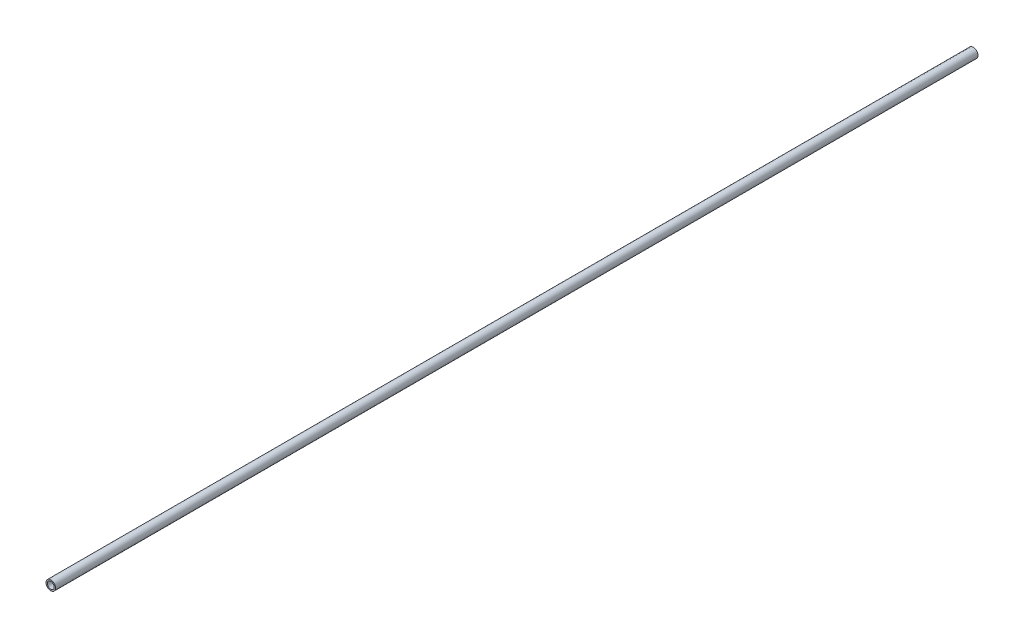
ISO-10303-21;
HEADER;
FILE_DESCRIPTION(('STEP AP214'),'2;1');
FILE_NAME('part.step','',(''),(''),'','','');
FILE_SCHEMA(('AUTOMOTIVE_DESIGN { 1 0 10303 214 1 1 1 1 }'));
ENDSEC;
DATA;
#1=APPLICATION_CONTEXT('core data for automotive mechanical design processes');
#2=APPLICATION_PROTOCOL_DEFINITION('international standard','automotive_design',2000,#1);
#3=PRODUCT_CONTEXT('',#1,'mechanical');
#4=PRODUCT('Part','Part','',(#3));
#5=PRODUCT_RELATED_PRODUCT_CATEGORY('part','',(#4));
#6=PRODUCT_DEFINITION_FORMATION('','',#4);
#7=PRODUCT_DEFINITION_CONTEXT('part definition',#1,'design');
#8=PRODUCT_DEFINITION('design','',#6,#7);
#9=PRODUCT_DEFINITION_SHAPE('','',#8);
#10=(LENGTH_UNIT() NAMED_UNIT(*) SI_UNIT(.MILLI.,.METRE.));
#11=(NAMED_UNIT(*) PLANE_ANGLE_UNIT() SI_UNIT($,.RADIAN.));
#12=(NAMED_UNIT(*) SI_UNIT($,.STERADIAN.) SOLID_ANGLE_UNIT());
#13=UNCERTAINTY_MEASURE_WITH_UNIT(LENGTH_MEASURE(1.E-05),#10,'distance_accuracy_value','');
#14=(GEOMETRIC_REPRESENTATION_CONTEXT(3) GLOBAL_UNCERTAINTY_ASSIGNED_CONTEXT((#13)) GLOBAL_UNIT_ASSIGNED_CONTEXT((#10,
#11,#12)) REPRESENTATION_CONTEXT('',''));
#15=CARTESIAN_POINT('',(0.,0.,0.));
#16=DIRECTION('',(0.,0.,1.));
#17=DIRECTION('',(1.,0.,0.));
#18=AXIS2_PLACEMENT_3D('',#15,#16,#17);
#19=CARTESIAN_POINT('',(0.,0.,-340.));
#20=DIRECTION('',(0.,0.,1.));
#21=DIRECTION('',(1.,0.,0.));
#22=AXIS2_PLACEMENT_3D('',#19,#20,#21);
#23=CYLINDRICAL_SURFACE('',#22,1.75);
#24=CARTESIAN_POINT('',(0.,0.,-340.));
#25=DIRECTION('',(0.,0.,1.));
#26=DIRECTION('',(1.,0.,0.));
#27=AXIS2_PLACEMENT_3D('',#24,#25,#26);
#28=CIRCLE('',#27,1.75);
#29=CARTESIAN_POINT('',(1.75,0.,-340.));
#30=VERTEX_POINT('',#29);
#31=EDGE_CURVE('E10',#30,#30,#28,.T.);
#32=ORIENTED_EDGE('',*,*,#31,.T.);
#33=EDGE_LOOP('',(#32));
#34=FACE_BOUND('',#33,.T.);
#35=CARTESIAN_POINT('',(0.,0.,0.));
#36=DIRECTION('',(0.,0.,1.));
#37=DIRECTION('',(1.,0.,0.));
#38=AXIS2_PLACEMENT_3D('',#35,#36,#37);
#39=CIRCLE('',#38,1.75);
#40=CARTESIAN_POINT('',(1.75,0.,0.));
#41=VERTEX_POINT('',#40);
#42=EDGE_CURVE('E42',#41,#41,#39,.T.);
#43=ORIENTED_EDGE('',*,*,#42,.F.);
#44=EDGE_LOOP('',(#43));
#45=FACE_BOUND('',#44,.T.);
#46=ADVANCED_FACE('F39',(#34,#45),#23,.T.);
#47=CARTESIAN_POINT('',(0.,0.,-340.));
#48=DIRECTION('',(0.,0.,1.));
#49=DIRECTION('',(1.,0.,0.));
#50=AXIS2_PLACEMENT_3D('',#47,#48,#49);
#51=PLANE('',#50);
#52=CARTESIAN_POINT('',(0.,0.,-340.));
#53=DIRECTION('',(0.,0.,1.));
#54=DIRECTION('',(1.,0.,0.));
#55=AXIS2_PLACEMENT_3D('',#52,#53,#54);
#56=CIRCLE('',#55,1.25);
#57=CARTESIAN_POINT('',(1.25,0.,-340.));
#58=VERTEX_POINT('',#57);
#59=EDGE_CURVE('E51',#58,#58,#56,.T.);
#60=ORIENTED_EDGE('',*,*,#59,.T.);
#61=EDGE_LOOP('',(#60));
#62=FACE_BOUND('',#61,.T.);
#63=ORIENTED_EDGE('',*,*,#31,.F.);
#64=EDGE_LOOP('',(#63));
#65=FACE_BOUND('',#64,.T.);
#66=ADVANCED_FACE('F61',(#62,#65),#51,.F.);
#67=CARTESIAN_POINT('',(0.,0.,0.));
#68=DIRECTION('',(0.,0.,1.));
#69=DIRECTION('',(1.,0.,0.));
#70=AXIS2_PLACEMENT_3D('',#67,#68,#69);
#71=PLANE('',#70);
#72=CARTESIAN_POINT('',(0.,0.,0.));
#73=DIRECTION('',(0.,0.,1.));
#74=DIRECTION('',(1.,0.,0.));
#75=AXIS2_PLACEMENT_3D('',#72,#73,#74);
#76=CIRCLE('',#75,1.25);
#77=CARTESIAN_POINT('',(1.25,0.,0.));
#78=VERTEX_POINT('',#77);
#79=EDGE_CURVE('E53',#78,#78,#76,.T.);
#80=ORIENTED_EDGE('',*,*,#79,.F.);
#81=EDGE_LOOP('',(#80));
#82=FACE_BOUND('',#81,.T.);
#83=ORIENTED_EDGE('',*,*,#42,.T.);
#84=EDGE_LOOP('',(#83));
#85=FACE_BOUND('',#84,.T.);
#86=ADVANCED_FACE('F67',(#82,#85),#71,.T.);
#87=CARTESIAN_POINT('',(0.,0.,-340.));
#88=DIRECTION('',(0.,0.,1.));
#89=DIRECTION('',(1.,0.,0.));
#90=AXIS2_PLACEMENT_3D('',#87,#88,#89);
#91=CYLINDRICAL_SURFACE('',#90,1.25);
#92=ORIENTED_EDGE('',*,*,#59,.F.);
#93=EDGE_LOOP('',(#92));
#94=FACE_BOUND('',#93,.T.);
#95=ORIENTED_EDGE('',*,*,#79,.T.);
#96=EDGE_LOOP('',(#95));
#97=FACE_BOUND('',#96,.T.);
#98=ADVANCED_FACE('F64',(#94,#97),#91,.F.);
#99=CLOSED_SHELL('',(#46,#66,#86,#98));
#100=MANIFOLD_SOLID_BREP('B2',#99);
#101=ADVANCED_BREP_SHAPE_REPRESENTATION('',(#18,#100),#14);
#102=SHAPE_DEFINITION_REPRESENTATION(#9,#101);
ENDSEC;
END-ISO-10303-21;
